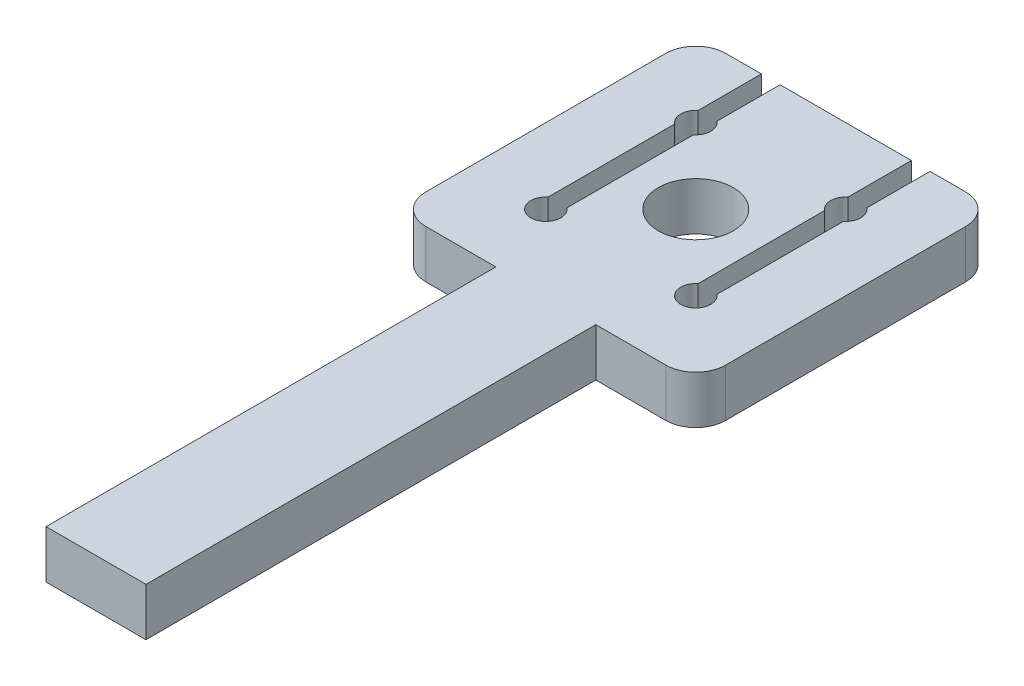
ISO-10303-21;
HEADER;
FILE_DESCRIPTION(('STEP AP214'),'2;1');
FILE_NAME('part.step','',(''),(''),'','','');
FILE_SCHEMA(('AUTOMOTIVE_DESIGN { 1 0 10303 214 1 1 1 1 }'));
ENDSEC;
DATA;
#1=APPLICATION_CONTEXT('core data for automotive mechanical design processes');
#2=APPLICATION_PROTOCOL_DEFINITION('international standard','automotive_design',2000,#1);
#3=PRODUCT_CONTEXT('',#1,'mechanical');
#4=PRODUCT('Part','Part','',(#3));
#5=PRODUCT_RELATED_PRODUCT_CATEGORY('part','',(#4));
#6=PRODUCT_DEFINITION_FORMATION('','',#4);
#7=PRODUCT_DEFINITION_CONTEXT('part definition',#1,'design');
#8=PRODUCT_DEFINITION('design','',#6,#7);
#9=PRODUCT_DEFINITION_SHAPE('','',#8);
#10=(LENGTH_UNIT() NAMED_UNIT(*) SI_UNIT(.MILLI.,.METRE.));
#11=(NAMED_UNIT(*) PLANE_ANGLE_UNIT() SI_UNIT($,.RADIAN.));
#12=(NAMED_UNIT(*) SI_UNIT($,.STERADIAN.) SOLID_ANGLE_UNIT());
#13=UNCERTAINTY_MEASURE_WITH_UNIT(LENGTH_MEASURE(1.E-05),#10,'distance_accuracy_value','');
#14=(GEOMETRIC_REPRESENTATION_CONTEXT(3) GLOBAL_UNCERTAINTY_ASSIGNED_CONTEXT((#13)) GLOBAL_UNIT_ASSIGNED_CONTEXT((#10,
#11,#12)) REPRESENTATION_CONTEXT('',''));
#15=CARTESIAN_POINT('',(0.,0.,0.));
#16=DIRECTION('',(0.,0.,1.));
#17=DIRECTION('',(1.,0.,0.));
#18=AXIS2_PLACEMENT_3D('',#15,#16,#17);
#19=CARTESIAN_POINT('',(-5.,3.2,5.));
#20=DIRECTION('',(0.,-1.,0.));
#21=DIRECTION('',(0.,0.,-1.));
#22=AXIS2_PLACEMENT_3D('',#19,#20,#21);
#23=CYLINDRICAL_SURFACE('',#22,0.999999999999925);
#24=CARTESIAN_POINT('',(-5.,0.,5.));
#25=DIRECTION('',(0.,1.,0.));
#26=DIRECTION('',(0.,0.,1.));
#27=AXIS2_PLACEMENT_3D('',#24,#25,#26);
#28=CIRCLE('',#27,0.999999999999925);
#29=CARTESIAN_POINT('',(-5.625,0.,4.21937525020019));
#30=VERTEX_POINT('',#29);
#31=CARTESIAN_POINT('',(-4.375,0.,4.21937525020019));
#32=VERTEX_POINT('',#31);
#33=EDGE_CURVE('E230',#30,#32,#28,.T.);
#34=ORIENTED_EDGE('',*,*,#33,.F.);
#35=DIRECTION('',(0.,-1.,0.));
#36=VECTOR('',#35,1.);
#37=CARTESIAN_POINT('',(-5.625,3.2,4.21937525020019));
#38=LINE('',#37,#36);
#39=CARTESIAN_POINT('',(-5.625,3.2,4.21937525020019));
#40=VERTEX_POINT('',#39);
#41=EDGE_CURVE('E224',#40,#30,#38,.T.);
#42=ORIENTED_EDGE('',*,*,#41,.F.);
#43=CARTESIAN_POINT('',(-5.,3.2,5.));
#44=DIRECTION('',(0.,1.,0.));
#45=DIRECTION('',(0.,0.,1.));
#46=AXIS2_PLACEMENT_3D('',#43,#44,#45);
#47=CIRCLE('',#46,0.999999999999925);
#48=CARTESIAN_POINT('',(-4.375,3.2,4.21937525020019));
#49=VERTEX_POINT('',#48);
#50=EDGE_CURVE('E227',#40,#49,#47,.T.);
#51=ORIENTED_EDGE('',*,*,#50,.T.);
#52=DIRECTION('',(0.,-1.,0.));
#53=VECTOR('',#52,1.);
#54=CARTESIAN_POINT('',(-4.375,3.2,4.21937525020019));
#55=LINE('',#54,#53);
#56=EDGE_CURVE('E290',#49,#32,#55,.T.);
#57=ORIENTED_EDGE('',*,*,#56,.T.);
#58=EDGE_LOOP('',(#34,#42,#51,#57));
#59=FACE_BOUND('',#58,.T.);
#60=ADVANCED_FACE('F37',(#59),#23,.F.);
#61=CARTESIAN_POINT('',(-5.625,3.2,0.));
#62=DIRECTION('',(-1.,0.,0.));
#63=DIRECTION('',(0.,0.,1.));
#64=AXIS2_PLACEMENT_3D('',#61,#62,#63);
#65=PLANE('',#64);
#66=DIRECTION('',(0.,0.,-1.));
#67=VECTOR('',#66,1.);
#68=CARTESIAN_POINT('',(-5.625,0.,0.));
#69=LINE('',#68,#67);
#70=CARTESIAN_POINT('',(-5.625,0.,-4.21937525020019));
#71=VERTEX_POINT('',#70);
#72=EDGE_CURVE('E292',#30,#71,#69,.T.);
#73=ORIENTED_EDGE('',*,*,#72,.T.);
#74=DIRECTION('',(0.,-1.,0.));
#75=VECTOR('',#74,1.);
#76=CARTESIAN_POINT('',(-5.625,3.2,-4.21937525020019));
#77=LINE('',#76,#75);
#78=CARTESIAN_POINT('',(-5.625,3.2,-4.21937525020019));
#79=VERTEX_POINT('',#78);
#80=EDGE_CURVE('E235',#79,#71,#77,.T.);
#81=ORIENTED_EDGE('',*,*,#80,.F.);
#82=DIRECTION('',(0.,0.,-1.));
#83=VECTOR('',#82,1.);
#84=CARTESIAN_POINT('',(-5.625,3.2,0.));
#85=LINE('',#84,#83);
#86=EDGE_CURVE('E238',#40,#79,#85,.T.);
#87=ORIENTED_EDGE('',*,*,#86,.F.);
#88=ORIENTED_EDGE('',*,*,#41,.T.);
#89=EDGE_LOOP('',(#73,#81,#87,#88));
#90=FACE_BOUND('',#89,.T.);
#91=ADVANCED_FACE('F239',(#90),#65,.F.);
#92=CARTESIAN_POINT('',(-5.,3.2,-5.));
#93=DIRECTION('',(0.,-1.,0.));
#94=DIRECTION('',(0.,0.,-1.));
#95=AXIS2_PLACEMENT_3D('',#92,#93,#94);
#96=CYLINDRICAL_SURFACE('',#95,0.999999999999972);
#97=CARTESIAN_POINT('',(-5.,0.,-5.));
#98=DIRECTION('',(0.,1.,0.));
#99=DIRECTION('',(0.,0.,1.));
#100=AXIS2_PLACEMENT_3D('',#97,#98,#99);
#101=CIRCLE('',#100,0.999999999999972);
#102=CARTESIAN_POINT('',(-5.625,0.,-5.7806247497998));
#103=VERTEX_POINT('',#102);
#104=EDGE_CURVE('E294',#103,#71,#101,.T.);
#105=ORIENTED_EDGE('',*,*,#104,.F.);
#106=DIRECTION('',(0.,-1.,0.));
#107=VECTOR('',#106,1.);
#108=CARTESIAN_POINT('',(-5.625,3.2,-5.7806247497998));
#109=LINE('',#108,#107);
#110=CARTESIAN_POINT('',(-5.625,3.2,-5.7806247497998));
#111=VERTEX_POINT('',#110);
#112=EDGE_CURVE('E384',#111,#103,#109,.T.);
#113=ORIENTED_EDGE('',*,*,#112,.F.);
#114=CARTESIAN_POINT('',(-5.,3.2,-5.));
#115=DIRECTION('',(0.,1.,0.));
#116=DIRECTION('',(0.,0.,1.));
#117=AXIS2_PLACEMENT_3D('',#114,#115,#116);
#118=CIRCLE('',#117,0.999999999999972);
#119=EDGE_CURVE('E242',#111,#79,#118,.T.);
#120=ORIENTED_EDGE('',*,*,#119,.T.);
#121=ORIENTED_EDGE('',*,*,#80,.T.);
#122=EDGE_LOOP('',(#105,#113,#120,#121));
#123=FACE_BOUND('',#122,.T.);
#124=ADVANCED_FACE('F584',(#123),#96,.F.);
#125=CARTESIAN_POINT('',(-5.625,3.2,0.));
#126=DIRECTION('',(-1.,0.,0.));
#127=DIRECTION('',(0.,0.,1.));
#128=AXIS2_PLACEMENT_3D('',#125,#126,#127);
#129=PLANE('',#128);
#130=DIRECTION('',(0.,0.,-1.));
#131=VECTOR('',#130,1.);
#132=CARTESIAN_POINT('',(-5.625,0.,0.));
#133=LINE('',#132,#131);
#134=CARTESIAN_POINT('',(-5.625,0.,-10.));
#135=VERTEX_POINT('',#134);
#136=EDGE_CURVE('E297',#103,#135,#133,.T.);
#137=ORIENTED_EDGE('',*,*,#136,.T.);
#138=DIRECTION('',(0.,-1.,0.));
#139=VECTOR('',#138,1.);
#140=CARTESIAN_POINT('',(-5.625,3.2,-10.));
#141=LINE('',#140,#139);
#142=CARTESIAN_POINT('',(-5.625,3.2,-10.));
#143=VERTEX_POINT('',#142);
#144=EDGE_CURVE('E381',#143,#135,#141,.T.);
#145=ORIENTED_EDGE('',*,*,#144,.F.);
#146=DIRECTION('',(0.,0.,-1.));
#147=VECTOR('',#146,1.);
#148=CARTESIAN_POINT('',(-5.625,3.2,0.));
#149=LINE('',#148,#147);
#150=EDGE_CURVE('E268',#111,#143,#149,.T.);
#151=ORIENTED_EDGE('',*,*,#150,.F.);
#152=ORIENTED_EDGE('',*,*,#112,.T.);
#153=EDGE_LOOP('',(#137,#145,#151,#152));
#154=FACE_BOUND('',#153,.T.);
#155=ADVANCED_FACE('F686',(#154),#129,.F.);
#156=CARTESIAN_POINT('',(0.,3.2,-10.));
#157=DIRECTION('',(0.,0.,-1.));
#158=DIRECTION('',(-1.,0.,0.));
#159=AXIS2_PLACEMENT_3D('',#156,#157,#158);
#160=PLANE('',#159);
#161=DIRECTION('',(1.,0.,0.));
#162=VECTOR('',#161,1.);
#163=CARTESIAN_POINT('',(0.,0.,-10.));
#164=LINE('',#163,#162);
#165=CARTESIAN_POINT('',(-8.,0.,-10.));
#166=VERTEX_POINT('',#165);
#167=EDGE_CURVE('E301',#166,#135,#164,.T.);
#168=ORIENTED_EDGE('',*,*,#167,.F.);
#169=DIRECTION('',(0.,-1.,0.));
#170=VECTOR('',#169,1.);
#171=CARTESIAN_POINT('',(-8.,3.2,-10.));
#172=LINE('',#171,#170);
#173=CARTESIAN_POINT('',(-8.,3.2,-10.));
#174=VERTEX_POINT('',#173);
#175=EDGE_CURVE('E45',#166,#174,#172,.F.);
#176=ORIENTED_EDGE('',*,*,#175,.T.);
#177=DIRECTION('',(1.,0.,0.));
#178=VECTOR('',#177,1.);
#179=CARTESIAN_POINT('',(0.,3.2,-10.));
#180=LINE('',#179,#178);
#181=EDGE_CURVE('E415',#174,#143,#180,.T.);
#182=ORIENTED_EDGE('',*,*,#181,.T.);
#183=ORIENTED_EDGE('',*,*,#144,.T.);
#184=EDGE_LOOP('',(#168,#176,#182,#183));
#185=FACE_BOUND('',#184,.T.);
#186=ADVANCED_FACE('F446',(#185),#160,.T.);
#187=CARTESIAN_POINT('',(-10.,3.2,0.));
#188=DIRECTION('',(1.,0.,0.));
#189=DIRECTION('',(0.,0.,-1.));
#190=AXIS2_PLACEMENT_3D('',#187,#188,#189);
#191=PLANE('',#190);
#192=DIRECTION('',(0.,0.,1.));
#193=VECTOR('',#192,1.);
#194=CARTESIAN_POINT('',(-10.,0.,0.));
#195=LINE('',#194,#193);
#196=CARTESIAN_POINT('',(-10.,0.,-8.));
#197=VERTEX_POINT('',#196);
#198=CARTESIAN_POINT('',(-10.,0.,8.));
#199=VERTEX_POINT('',#198);
#200=EDGE_CURVE('E303',#197,#199,#195,.T.);
#201=ORIENTED_EDGE('',*,*,#200,.T.);
#202=DIRECTION('',(0.,-1.,0.));
#203=VECTOR('',#202,1.);
#204=CARTESIAN_POINT('',(-10.,3.2,8.));
#205=LINE('',#204,#203);
#206=CARTESIAN_POINT('',(-10.,3.2,8.));
#207=VERTEX_POINT('',#206);
#208=EDGE_CURVE('E400',#199,#207,#205,.F.);
#209=ORIENTED_EDGE('',*,*,#208,.T.);
#210=DIRECTION('',(0.,0.,1.));
#211=VECTOR('',#210,1.);
#212=CARTESIAN_POINT('',(-10.,3.2,0.));
#213=LINE('',#212,#211);
#214=CARTESIAN_POINT('',(-10.,3.2,-8.));
#215=VERTEX_POINT('',#214);
#216=EDGE_CURVE('E418',#215,#207,#213,.T.);
#217=ORIENTED_EDGE('',*,*,#216,.F.);
#218=DIRECTION('',(0.,-1.,0.));
#219=VECTOR('',#218,1.);
#220=CARTESIAN_POINT('',(-10.,0.,-8.));
#221=LINE('',#220,#219);
#222=EDGE_CURVE('E397',#215,#197,#221,.T.);
#223=ORIENTED_EDGE('',*,*,#222,.T.);
#224=EDGE_LOOP('',(#201,#209,#217,#223));
#225=FACE_BOUND('',#224,.T.);
#226=ADVANCED_FACE('F457',(#225),#191,.F.);
#227=CARTESIAN_POINT('',(0.,3.2,10.));
#228=DIRECTION('',(0.,0.,-1.));
#229=DIRECTION('',(-1.,0.,0.));
#230=AXIS2_PLACEMENT_3D('',#227,#228,#229);
#231=PLANE('',#230);
#232=DIRECTION('',(1.,0.,0.));
#233=VECTOR('',#232,1.);
#234=CARTESIAN_POINT('',(0.,3.2,10.));
#235=LINE('',#234,#233);
#236=CARTESIAN_POINT('',(-8.,3.2,10.));
#237=VERTEX_POINT('',#236);
#238=CARTESIAN_POINT('',(-3.33333333333334,3.2,10.));
#239=VERTEX_POINT('',#238);
#240=EDGE_CURVE('E424',#237,#239,#235,.T.);
#241=ORIENTED_EDGE('',*,*,#240,.F.);
#242=DIRECTION('',(0.,-1.,0.));
#243=VECTOR('',#242,1.);
#244=CARTESIAN_POINT('',(-8.,3.2,10.));
#245=LINE('',#244,#243);
#246=CARTESIAN_POINT('',(-8.,0.,10.));
#247=VERTEX_POINT('',#246);
#248=EDGE_CURVE('E234',#237,#247,#245,.T.);
#249=ORIENTED_EDGE('',*,*,#248,.T.);
#250=DIRECTION('',(1.,0.,0.));
#251=VECTOR('',#250,1.);
#252=CARTESIAN_POINT('',(0.,0.,10.));
#253=LINE('',#252,#251);
#254=CARTESIAN_POINT('',(-3.33333333333334,0.,10.));
#255=VERTEX_POINT('',#254);
#256=EDGE_CURVE('E308',#247,#255,#253,.T.);
#257=ORIENTED_EDGE('',*,*,#256,.T.);
#258=DIRECTION('',(0.,-1.,0.));
#259=VECTOR('',#258,1.);
#260=CARTESIAN_POINT('',(-3.33333333333334,3.2,10.));
#261=LINE('',#260,#259);
#262=EDGE_CURVE('E378',#239,#255,#261,.T.);
#263=ORIENTED_EDGE('',*,*,#262,.F.);
#264=EDGE_LOOP('',(#241,#249,#257,#263));
#265=FACE_BOUND('',#264,.T.);
#266=ADVANCED_FACE('F470',(#265),#231,.F.);
#267=CARTESIAN_POINT('',(-3.33333333333334,3.2,0.));
#268=DIRECTION('',(1.,0.,0.));
#269=DIRECTION('',(0.,0.,-1.));
#270=AXIS2_PLACEMENT_3D('',#267,#268,#269);
#271=PLANE('',#270);
#272=DIRECTION('',(0.,0.,1.));
#273=VECTOR('',#272,1.);
#274=CARTESIAN_POINT('',(-3.33333333333334,0.,0.));
#275=LINE('',#274,#273);
#276=CARTESIAN_POINT('',(-3.33333333333333,0.,40.));
#277=VERTEX_POINT('',#276);
#278=EDGE_CURVE('E310',#255,#277,#275,.T.);
#279=ORIENTED_EDGE('',*,*,#278,.T.);
#280=DIRECTION('',(0.,-1.,0.));
#281=VECTOR('',#280,1.);
#282=CARTESIAN_POINT('',(-3.33333333333333,3.2,40.));
#283=LINE('',#282,#281);
#284=CARTESIAN_POINT('',(-3.33333333333333,3.2,40.));
#285=VERTEX_POINT('',#284);
#286=EDGE_CURVE('E375',#285,#277,#283,.T.);
#287=ORIENTED_EDGE('',*,*,#286,.F.);
#288=DIRECTION('',(0.,0.,1.));
#289=VECTOR('',#288,1.);
#290=CARTESIAN_POINT('',(-3.33333333333334,3.2,0.));
#291=LINE('',#290,#289);
#292=EDGE_CURVE('E473',#239,#285,#291,.T.);
#293=ORIENTED_EDGE('',*,*,#292,.F.);
#294=ORIENTED_EDGE('',*,*,#262,.T.);
#295=EDGE_LOOP('',(#279,#287,#293,#294));
#296=FACE_BOUND('',#295,.T.);
#297=ADVANCED_FACE('F570',(#296),#271,.F.);
#298=CARTESIAN_POINT('',(0.,3.2,40.));
#299=DIRECTION('',(0.,0.,-1.));
#300=DIRECTION('',(-1.,0.,0.));
#301=AXIS2_PLACEMENT_3D('',#298,#299,#300);
#302=PLANE('',#301);
#303=DIRECTION('',(1.,0.,0.));
#304=VECTOR('',#303,1.);
#305=CARTESIAN_POINT('',(0.,0.,40.));
#306=LINE('',#305,#304);
#307=CARTESIAN_POINT('',(3.33333333333333,0.,40.));
#308=VERTEX_POINT('',#307);
#309=EDGE_CURVE('E312',#277,#308,#306,.T.);
#310=ORIENTED_EDGE('',*,*,#309,.T.);
#311=DIRECTION('',(0.,-1.,0.));
#312=VECTOR('',#311,1.);
#313=CARTESIAN_POINT('',(3.33333333333333,3.2,40.));
#314=LINE('',#313,#312);
#315=CARTESIAN_POINT('',(3.33333333333333,3.2,40.));
#316=VERTEX_POINT('',#315);
#317=EDGE_CURVE('E372',#316,#308,#314,.T.);
#318=ORIENTED_EDGE('',*,*,#317,.F.);
#319=DIRECTION('',(1.,0.,0.));
#320=VECTOR('',#319,1.);
#321=CARTESIAN_POINT('',(0.,3.2,40.));
#322=LINE('',#321,#320);
#323=EDGE_CURVE('E474',#285,#316,#322,.T.);
#324=ORIENTED_EDGE('',*,*,#323,.F.);
#325=ORIENTED_EDGE('',*,*,#286,.T.);
#326=EDGE_LOOP('',(#310,#318,#324,#325));
#327=FACE_BOUND('',#326,.T.);
#328=ADVANCED_FACE('F567',(#327),#302,.F.);
#329=CARTESIAN_POINT('',(3.33333333333333,3.2,0.));
#330=DIRECTION('',(-1.,0.,0.));
#331=DIRECTION('',(0.,0.,1.));
#332=AXIS2_PLACEMENT_3D('',#329,#330,#331);
#333=PLANE('',#332);
#334=DIRECTION('',(0.,0.,-1.));
#335=VECTOR('',#334,1.);
#336=CARTESIAN_POINT('',(3.33333333333333,0.,0.));
#337=LINE('',#336,#335);
#338=CARTESIAN_POINT('',(3.33333333333333,0.,10.));
#339=VERTEX_POINT('',#338);
#340=EDGE_CURVE('E314',#308,#339,#337,.T.);
#341=ORIENTED_EDGE('',*,*,#340,.T.);
#342=DIRECTION('',(0.,-1.,0.));
#343=VECTOR('',#342,1.);
#344=CARTESIAN_POINT('',(3.33333333333333,3.2,10.));
#345=LINE('',#344,#343);
#346=CARTESIAN_POINT('',(3.33333333333333,3.2,10.));
#347=VERTEX_POINT('',#346);
#348=EDGE_CURVE('E369',#347,#339,#345,.T.);
#349=ORIENTED_EDGE('',*,*,#348,.F.);
#350=DIRECTION('',(0.,0.,-1.));
#351=VECTOR('',#350,1.);
#352=CARTESIAN_POINT('',(3.33333333333333,3.2,0.));
#353=LINE('',#352,#351);
#354=EDGE_CURVE('E476',#316,#347,#353,.T.);
#355=ORIENTED_EDGE('',*,*,#354,.F.);
#356=ORIENTED_EDGE('',*,*,#317,.T.);
#357=EDGE_LOOP('',(#341,#349,#355,#356));
#358=FACE_BOUND('',#357,.T.);
#359=ADVANCED_FACE('F563',(#358),#333,.F.);
#360=CARTESIAN_POINT('',(0.,3.2,10.));
#361=DIRECTION('',(0.,0.,-1.));
#362=DIRECTION('',(-1.,0.,0.));
#363=AXIS2_PLACEMENT_3D('',#360,#361,#362);
#364=PLANE('',#363);
#365=DIRECTION('',(1.,0.,0.));
#366=VECTOR('',#365,1.);
#367=CARTESIAN_POINT('',(0.,0.,10.));
#368=LINE('',#367,#366);
#369=CARTESIAN_POINT('',(8.,0.,10.));
#370=VERTEX_POINT('',#369);
#371=EDGE_CURVE('E316',#339,#370,#368,.T.);
#372=ORIENTED_EDGE('',*,*,#371,.T.);
#373=DIRECTION('',(0.,-1.,0.));
#374=VECTOR('',#373,1.);
#375=CARTESIAN_POINT('',(8.,3.2,10.));
#376=LINE('',#375,#374);
#377=CARTESIAN_POINT('',(8.,3.2,10.));
#378=VERTEX_POINT('',#377);
#379=EDGE_CURVE('E441',#370,#378,#376,.F.);
#380=ORIENTED_EDGE('',*,*,#379,.T.);
#381=DIRECTION('',(1.,0.,0.));
#382=VECTOR('',#381,1.);
#383=CARTESIAN_POINT('',(0.,3.2,10.));
#384=LINE('',#383,#382);
#385=EDGE_CURVE('E486',#347,#378,#384,.T.);
#386=ORIENTED_EDGE('',*,*,#385,.F.);
#387=ORIENTED_EDGE('',*,*,#348,.T.);
#388=EDGE_LOOP('',(#372,#380,#386,#387));
#389=FACE_BOUND('',#388,.T.);
#390=ADVANCED_FACE('F558',(#389),#364,.F.);
#391=CARTESIAN_POINT('',(10.,3.2,0.));
#392=DIRECTION('',(1.,0.,0.));
#393=DIRECTION('',(0.,0.,-1.));
#394=AXIS2_PLACEMENT_3D('',#391,#392,#393);
#395=PLANE('',#394);
#396=DIRECTION('',(0.,0.,1.));
#397=VECTOR('',#396,1.);
#398=CARTESIAN_POINT('',(10.,3.2,0.));
#399=LINE('',#398,#397);
#400=CARTESIAN_POINT('',(10.,3.2,-8.));
#401=VERTEX_POINT('',#400);
#402=CARTESIAN_POINT('',(10.,3.2,8.00000000000001));
#403=VERTEX_POINT('',#402);
#404=EDGE_CURVE('E488',#401,#403,#399,.T.);
#405=ORIENTED_EDGE('',*,*,#404,.T.);
#406=DIRECTION('',(0.,-1.,0.));
#407=VECTOR('',#406,1.);
#408=CARTESIAN_POINT('',(10.,0.,8.00000000000001));
#409=LINE('',#408,#407);
#410=CARTESIAN_POINT('',(10.,0.,8.00000000000001));
#411=VERTEX_POINT('',#410);
#412=EDGE_CURVE('E438',#403,#411,#409,.T.);
#413=ORIENTED_EDGE('',*,*,#412,.T.);
#414=DIRECTION('',(0.,0.,1.));
#415=VECTOR('',#414,1.);
#416=CARTESIAN_POINT('',(10.,0.,0.));
#417=LINE('',#416,#415);
#418=CARTESIAN_POINT('',(10.,0.,-8.));
#419=VERTEX_POINT('',#418);
#420=EDGE_CURVE('E319',#419,#411,#417,.T.);
#421=ORIENTED_EDGE('',*,*,#420,.F.);
#422=DIRECTION('',(0.,-1.,0.));
#423=VECTOR('',#422,1.);
#424=CARTESIAN_POINT('',(10.,3.2,-8.));
#425=LINE('',#424,#423);
#426=EDGE_CURVE('E435',#419,#401,#425,.F.);
#427=ORIENTED_EDGE('',*,*,#426,.T.);
#428=EDGE_LOOP('',(#405,#413,#421,#427));
#429=FACE_BOUND('',#428,.T.);
#430=ADVANCED_FACE('F550',(#429),#395,.T.);
#431=CARTESIAN_POINT('',(5.625,3.2,-10.));
#432=VERTEX_POINT('',#431);
#433=CARTESIAN_POINT('',(8.,3.2,-10.));
#434=VERTEX_POINT('',#433);
#435=EDGE_CURVE('E419',#432,#434,#180,.T.);
#436=ORIENTED_EDGE('',*,*,#435,.T.);
#437=DIRECTION('',(0.,-1.,0.));
#438=VECTOR('',#437,1.);
#439=CARTESIAN_POINT('',(8.,3.2,-10.));
#440=LINE('',#439,#438);
#441=CARTESIAN_POINT('',(8.,0.,-10.));
#442=VERTEX_POINT('',#441);
#443=EDGE_CURVE('E12',#434,#442,#440,.T.);
#444=ORIENTED_EDGE('',*,*,#443,.T.);
#445=CARTESIAN_POINT('',(5.625,0.,-10.));
#446=VERTEX_POINT('',#445);
#447=EDGE_CURVE('E305',#446,#442,#164,.T.);
#448=ORIENTED_EDGE('',*,*,#447,.F.);
#449=DIRECTION('',(0.,-1.,0.));
#450=VECTOR('',#449,1.);
#451=CARTESIAN_POINT('',(5.625,3.2,-10.));
#452=LINE('',#451,#450);
#453=EDGE_CURVE('E367',#432,#446,#452,.T.);
#454=ORIENTED_EDGE('',*,*,#453,.F.);
#455=EDGE_LOOP('',(#436,#444,#448,#454));
#456=FACE_BOUND('',#455,.T.);
#457=ADVANCED_FACE('F543',(#456),#160,.T.);
#458=CARTESIAN_POINT('',(5.625,3.2,0.));
#459=DIRECTION('',(-1.,0.,0.));
#460=DIRECTION('',(0.,0.,1.));
#461=AXIS2_PLACEMENT_3D('',#458,#459,#460);
#462=PLANE('',#461);
#463=DIRECTION('',(0.,0.,-1.));
#464=VECTOR('',#463,1.);
#465=CARTESIAN_POINT('',(5.625,0.,0.));
#466=LINE('',#465,#464);
#467=CARTESIAN_POINT('',(5.625,0.,-5.78062474979979));
#468=VERTEX_POINT('',#467);
#469=EDGE_CURVE('E322',#468,#446,#466,.T.);
#470=ORIENTED_EDGE('',*,*,#469,.F.);
#471=DIRECTION('',(0.,-1.,0.));
#472=VECTOR('',#471,1.);
#473=CARTESIAN_POINT('',(5.625,3.2,-5.78062474979979));
#474=LINE('',#473,#472);
#475=CARTESIAN_POINT('',(5.625,3.2,-5.78062474979979));
#476=VERTEX_POINT('',#475);
#477=EDGE_CURVE('E365',#476,#468,#474,.T.);
#478=ORIENTED_EDGE('',*,*,#477,.F.);
#479=DIRECTION('',(0.,0.,-1.));
#480=VECTOR('',#479,1.);
#481=CARTESIAN_POINT('',(5.625,3.2,0.));
#482=LINE('',#481,#480);
#483=EDGE_CURVE('E490',#476,#432,#482,.T.);
#484=ORIENTED_EDGE('',*,*,#483,.T.);
#485=ORIENTED_EDGE('',*,*,#453,.T.);
#486=EDGE_LOOP('',(#470,#478,#484,#485));
#487=FACE_BOUND('',#486,.T.);
#488=ADVANCED_FACE('F641',(#487),#462,.T.);
#489=CARTESIAN_POINT('',(5.,3.2,-5.));
#490=DIRECTION('',(0.,-1.,0.));
#491=DIRECTION('',(0.,0.,-1.));
#492=AXIS2_PLACEMENT_3D('',#489,#490,#491);
#493=CYLINDRICAL_SURFACE('',#492,1.00000000000005);
#494=CARTESIAN_POINT('',(5.,0.,-5.));
#495=DIRECTION('',(0.,1.,0.));
#496=DIRECTION('',(0.,0.,1.));
#497=AXIS2_PLACEMENT_3D('',#494,#495,#496);
#498=CIRCLE('',#497,1.00000000000005);
#499=CARTESIAN_POINT('',(5.625,0.,-4.21937525020018));
#500=VERTEX_POINT('',#499);
#501=EDGE_CURVE('E325',#500,#468,#498,.T.);
#502=ORIENTED_EDGE('',*,*,#501,.F.);
#503=DIRECTION('',(0.,-1.,0.));
#504=VECTOR('',#503,1.);
#505=CARTESIAN_POINT('',(5.625,3.2,-4.21937525020018));
#506=LINE('',#505,#504);
#507=CARTESIAN_POINT('',(5.625,3.2,-4.21937525020018));
#508=VERTEX_POINT('',#507);
#509=EDGE_CURVE('E363',#508,#500,#506,.T.);
#510=ORIENTED_EDGE('',*,*,#509,.F.);
#511=CARTESIAN_POINT('',(5.,3.2,-5.));
#512=DIRECTION('',(0.,1.,0.));
#513=DIRECTION('',(0.,0.,1.));
#514=AXIS2_PLACEMENT_3D('',#511,#512,#513);
#515=CIRCLE('',#514,1.00000000000005);
#516=EDGE_CURVE('E494',#508,#476,#515,.T.);
#517=ORIENTED_EDGE('',*,*,#516,.T.);
#518=ORIENTED_EDGE('',*,*,#477,.T.);
#519=EDGE_LOOP('',(#502,#510,#517,#518));
#520=FACE_BOUND('',#519,.T.);
#521=ADVANCED_FACE('F523',(#520),#493,.F.);
#522=CARTESIAN_POINT('',(5.625,3.2,0.));
#523=DIRECTION('',(-1.,0.,0.));
#524=DIRECTION('',(0.,0.,1.));
#525=AXIS2_PLACEMENT_3D('',#522,#523,#524);
#526=PLANE('',#525);
#527=DIRECTION('',(0.,0.,-1.));
#528=VECTOR('',#527,1.);
#529=CARTESIAN_POINT('',(5.625,0.,0.));
#530=LINE('',#529,#528);
#531=CARTESIAN_POINT('',(5.625,0.,4.2193752502002));
#532=VERTEX_POINT('',#531);
#533=EDGE_CURVE('E328',#532,#500,#530,.T.);
#534=ORIENTED_EDGE('',*,*,#533,.F.);
#535=DIRECTION('',(0.,-1.,0.));
#536=VECTOR('',#535,1.);
#537=CARTESIAN_POINT('',(5.625,3.2,4.2193752502002));
#538=LINE('',#537,#536);
#539=CARTESIAN_POINT('',(5.625,3.2,4.2193752502002));
#540=VERTEX_POINT('',#539);
#541=EDGE_CURVE('E361',#540,#532,#538,.T.);
#542=ORIENTED_EDGE('',*,*,#541,.F.);
#543=DIRECTION('',(0.,0.,-1.));
#544=VECTOR('',#543,1.);
#545=CARTESIAN_POINT('',(5.625,3.2,0.));
#546=LINE('',#545,#544);
#547=EDGE_CURVE('E498',#540,#508,#546,.T.);
#548=ORIENTED_EDGE('',*,*,#547,.T.);
#549=ORIENTED_EDGE('',*,*,#509,.T.);
#550=EDGE_LOOP('',(#534,#542,#548,#549));
#551=FACE_BOUND('',#550,.T.);
#552=ADVANCED_FACE('F518',(#551),#526,.T.);
#553=CARTESIAN_POINT('',(5.00000000000003,3.2,5.00000000000004));
#554=DIRECTION('',(0.,-1.,0.));
#555=DIRECTION('',(0.,0.,-1.));
#556=AXIS2_PLACEMENT_3D('',#553,#554,#555);
#557=CYLINDRICAL_SURFACE('',#556,0.999999999999999);
#558=CARTESIAN_POINT('',(5.00000000000003,0.,5.00000000000004));
#559=DIRECTION('',(0.,1.,0.));
#560=DIRECTION('',(0.,0.,1.));
#561=AXIS2_PLACEMENT_3D('',#558,#559,#560);
#562=CIRCLE('',#561,0.999999999999999);
#563=CARTESIAN_POINT('',(4.375,0.,4.2193752502002));
#564=VERTEX_POINT('',#563);
#565=EDGE_CURVE('E332',#564,#532,#562,.T.);
#566=ORIENTED_EDGE('',*,*,#565,.F.);
#567=DIRECTION('',(0.,-1.,0.));
#568=VECTOR('',#567,1.);
#569=CARTESIAN_POINT('',(4.375,3.2,4.2193752502002));
#570=LINE('',#569,#568);
#571=CARTESIAN_POINT('',(4.375,3.2,4.2193752502002));
#572=VERTEX_POINT('',#571);
#573=EDGE_CURVE('E359',#572,#564,#570,.T.);
#574=ORIENTED_EDGE('',*,*,#573,.F.);
#575=CARTESIAN_POINT('',(5.00000000000003,3.2,5.00000000000004));
#576=DIRECTION('',(0.,1.,0.));
#577=DIRECTION('',(0.,0.,1.));
#578=AXIS2_PLACEMENT_3D('',#575,#576,#577);
#579=CIRCLE('',#578,0.999999999999999);
#580=EDGE_CURVE('E509',#572,#540,#579,.T.);
#581=ORIENTED_EDGE('',*,*,#580,.T.);
#582=ORIENTED_EDGE('',*,*,#541,.T.);
#583=EDGE_LOOP('',(#566,#574,#581,#582));
#584=FACE_BOUND('',#583,.T.);
#585=ADVANCED_FACE('F528',(#584),#557,.F.);
#586=CARTESIAN_POINT('',(4.375,3.2,0.));
#587=DIRECTION('',(-1.,0.,0.));
#588=DIRECTION('',(0.,0.,1.));
#589=AXIS2_PLACEMENT_3D('',#586,#587,#588);
#590=PLANE('',#589);
#591=DIRECTION('',(0.,0.,-1.));
#592=VECTOR('',#591,1.);
#593=CARTESIAN_POINT('',(4.375,0.,0.));
#594=LINE('',#593,#592);
#595=CARTESIAN_POINT('',(4.375,0.,-4.21937525020018));
#596=VERTEX_POINT('',#595);
#597=EDGE_CURVE('E335',#564,#596,#594,.T.);
#598=ORIENTED_EDGE('',*,*,#597,.T.);
#599=DIRECTION('',(0.,-1.,0.));
#600=VECTOR('',#599,1.);
#601=CARTESIAN_POINT('',(4.375,3.2,-4.21937525020018));
#602=LINE('',#601,#600);
#603=CARTESIAN_POINT('',(4.375,3.2,-4.21937525020018));
#604=VERTEX_POINT('',#603);
#605=EDGE_CURVE('E357',#604,#596,#602,.T.);
#606=ORIENTED_EDGE('',*,*,#605,.F.);
#607=DIRECTION('',(0.,0.,-1.));
#608=VECTOR('',#607,1.);
#609=CARTESIAN_POINT('',(4.375,3.2,0.));
#610=LINE('',#609,#608);
#611=EDGE_CURVE('E507',#572,#604,#610,.T.);
#612=ORIENTED_EDGE('',*,*,#611,.F.);
#613=ORIENTED_EDGE('',*,*,#573,.T.);
#614=EDGE_LOOP('',(#598,#606,#612,#613));
#615=FACE_BOUND('',#614,.T.);
#616=ADVANCED_FACE('F532',(#615),#590,.F.);
#617=CARTESIAN_POINT('',(4.375,0.,-5.78062474979979));
#618=VERTEX_POINT('',#617);
#619=EDGE_CURVE('E329',#618,#596,#498,.T.);
#620=ORIENTED_EDGE('',*,*,#619,.F.);
#621=DIRECTION('',(0.,-1.,0.));
#622=VECTOR('',#621,1.);
#623=CARTESIAN_POINT('',(4.375,3.2,-5.78062474979979));
#624=LINE('',#623,#622);
#625=CARTESIAN_POINT('',(4.375,3.2,-5.78062474979979));
#626=VERTEX_POINT('',#625);
#627=EDGE_CURVE('E355',#626,#618,#624,.T.);
#628=ORIENTED_EDGE('',*,*,#627,.F.);
#629=EDGE_CURVE('E499',#626,#604,#515,.T.);
#630=ORIENTED_EDGE('',*,*,#629,.T.);
#631=ORIENTED_EDGE('',*,*,#605,.T.);
#632=EDGE_LOOP('',(#620,#628,#630,#631));
#633=FACE_BOUND('',#632,.T.);
#634=ADVANCED_FACE('F741',(#633),#493,.F.);
#635=CARTESIAN_POINT('',(4.375,3.2,0.));
#636=DIRECTION('',(-1.,0.,0.));
#637=DIRECTION('',(0.,0.,1.));
#638=AXIS2_PLACEMENT_3D('',#635,#636,#637);
#639=PLANE('',#638);
#640=DIRECTION('',(0.,0.,-1.));
#641=VECTOR('',#640,1.);
#642=CARTESIAN_POINT('',(4.375,0.,0.));
#643=LINE('',#642,#641);
#644=CARTESIAN_POINT('',(4.375,0.,-10.));
#645=VERTEX_POINT('',#644);
#646=EDGE_CURVE('E338',#618,#645,#643,.T.);
#647=ORIENTED_EDGE('',*,*,#646,.T.);
#648=DIRECTION('',(0.,-1.,0.));
#649=VECTOR('',#648,1.);
#650=CARTESIAN_POINT('',(4.375,3.2,-10.));
#651=LINE('',#650,#649);
#652=CARTESIAN_POINT('',(4.375,3.2,-10.));
#653=VERTEX_POINT('',#652);
#654=EDGE_CURVE('E353',#653,#645,#651,.T.);
#655=ORIENTED_EDGE('',*,*,#654,.F.);
#656=DIRECTION('',(0.,0.,-1.));
#657=VECTOR('',#656,1.);
#658=CARTESIAN_POINT('',(4.375,3.2,0.));
#659=LINE('',#658,#657);
#660=EDGE_CURVE('E282',#626,#653,#659,.T.);
#661=ORIENTED_EDGE('',*,*,#660,.F.);
#662=ORIENTED_EDGE('',*,*,#627,.T.);
#663=EDGE_LOOP('',(#647,#655,#661,#662));
#664=FACE_BOUND('',#663,.T.);
#665=ADVANCED_FACE('F733',(#664),#639,.F.);
#666=CARTESIAN_POINT('',(-4.375,0.,-10.));
#667=VERTEX_POINT('',#666);
#668=EDGE_CURVE('E304',#667,#645,#164,.T.);
#669=ORIENTED_EDGE('',*,*,#668,.F.);
#670=DIRECTION('',(0.,-1.,0.));
#671=VECTOR('',#670,1.);
#672=CARTESIAN_POINT('',(-4.375,3.2,-10.));
#673=LINE('',#672,#671);
#674=CARTESIAN_POINT('',(-4.375,3.2,-10.));
#675=VERTEX_POINT('',#674);
#676=EDGE_CURVE('E351',#675,#667,#673,.T.);
#677=ORIENTED_EDGE('',*,*,#676,.F.);
#678=EDGE_CURVE('E281',#675,#653,#180,.T.);
#679=ORIENTED_EDGE('',*,*,#678,.T.);
#680=ORIENTED_EDGE('',*,*,#654,.T.);
#681=EDGE_LOOP('',(#669,#677,#679,#680));
#682=FACE_BOUND('',#681,.T.);
#683=ADVANCED_FACE('F643',(#682),#160,.T.);
#684=CARTESIAN_POINT('',(-4.375,3.2,0.));
#685=DIRECTION('',(-1.,0.,0.));
#686=DIRECTION('',(0.,0.,1.));
#687=AXIS2_PLACEMENT_3D('',#684,#685,#686);
#688=PLANE('',#687);
#689=DIRECTION('',(0.,0.,-1.));
#690=VECTOR('',#689,1.);
#691=CARTESIAN_POINT('',(-4.375,0.,0.));
#692=LINE('',#691,#690);
#693=CARTESIAN_POINT('',(-4.375,0.,-5.78062474979981));
#694=VERTEX_POINT('',#693);
#695=EDGE_CURVE('E341',#694,#667,#692,.T.);
#696=ORIENTED_EDGE('',*,*,#695,.F.);
#697=DIRECTION('',(0.,-1.,0.));
#698=VECTOR('',#697,1.);
#699=CARTESIAN_POINT('',(-4.375,3.2,-5.78062474979981));
#700=LINE('',#699,#698);
#701=CARTESIAN_POINT('',(-4.375,3.2,-5.78062474979981));
#702=VERTEX_POINT('',#701);
#703=EDGE_CURVE('E349',#702,#694,#700,.T.);
#704=ORIENTED_EDGE('',*,*,#703,.F.);
#705=DIRECTION('',(0.,0.,-1.));
#706=VECTOR('',#705,1.);
#707=CARTESIAN_POINT('',(-4.375,3.2,0.));
#708=LINE('',#707,#706);
#709=EDGE_CURVE('E277',#702,#675,#708,.T.);
#710=ORIENTED_EDGE('',*,*,#709,.T.);
#711=ORIENTED_EDGE('',*,*,#676,.T.);
#712=EDGE_LOOP('',(#696,#704,#710,#711));
#713=FACE_BOUND('',#712,.T.);
#714=ADVANCED_FACE('F714',(#713),#688,.T.);
#715=CARTESIAN_POINT('',(-4.375,0.,-4.21937525020019));
#716=VERTEX_POINT('',#715);
#717=EDGE_CURVE('E298',#716,#694,#101,.T.);
#718=ORIENTED_EDGE('',*,*,#717,.F.);
#719=DIRECTION('',(0.,-1.,0.));
#720=VECTOR('',#719,1.);
#721=CARTESIAN_POINT('',(-4.375,3.2,-4.21937525020019));
#722=LINE('',#721,#720);
#723=CARTESIAN_POINT('',(-4.375,3.2,-4.21937525020019));
#724=VERTEX_POINT('',#723);
#725=EDGE_CURVE('E347',#724,#716,#722,.T.);
#726=ORIENTED_EDGE('',*,*,#725,.F.);
#727=EDGE_CURVE('E269',#724,#702,#118,.T.);
#728=ORIENTED_EDGE('',*,*,#727,.T.);
#729=ORIENTED_EDGE('',*,*,#703,.T.);
#730=EDGE_LOOP('',(#718,#726,#728,#729));
#731=FACE_BOUND('',#730,.T.);
#732=ADVANCED_FACE('F704',(#731),#96,.F.);
#733=CARTESIAN_POINT('',(-4.375,3.2,0.));
#734=DIRECTION('',(-1.,0.,0.));
#735=DIRECTION('',(0.,0.,1.));
#736=AXIS2_PLACEMENT_3D('',#733,#734,#735);
#737=PLANE('',#736);
#738=DIRECTION('',(0.,0.,-1.));
#739=VECTOR('',#738,1.);
#740=CARTESIAN_POINT('',(-4.375,0.,0.));
#741=LINE('',#740,#739);
#742=EDGE_CURVE('E253',#32,#716,#741,.T.);
#743=ORIENTED_EDGE('',*,*,#742,.F.);
#744=ORIENTED_EDGE('',*,*,#56,.F.);
#745=DIRECTION('',(0.,0.,-1.));
#746=VECTOR('',#745,1.);
#747=CARTESIAN_POINT('',(-4.375,3.2,0.));
#748=LINE('',#747,#746);
#749=EDGE_CURVE('E249',#49,#724,#748,.T.);
#750=ORIENTED_EDGE('',*,*,#749,.T.);
#751=ORIENTED_EDGE('',*,*,#725,.T.);
#752=EDGE_LOOP('',(#743,#744,#750,#751));
#753=FACE_BOUND('',#752,.T.);
#754=ADVANCED_FACE('F694',(#753),#737,.T.);
#755=CARTESIAN_POINT('',(0.,3.2,0.));
#756=DIRECTION('',(0.,-1.,0.));
#757=DIRECTION('',(0.,0.,-1.));
#758=AXIS2_PLACEMENT_3D('',#755,#756,#757);
#759=CYLINDRICAL_SURFACE('',#758,2.5);
#760=CARTESIAN_POINT('',(0.,3.2,0.));
#761=DIRECTION('',(0.,1.,0.));
#762=DIRECTION('',(0.,0.,1.));
#763=AXIS2_PLACEMENT_3D('',#760,#761,#762);
#764=CIRCLE('',#763,2.5);
#765=CARTESIAN_POINT('',(0.,3.2,2.5));
#766=VERTEX_POINT('',#765);
#767=EDGE_CURVE('E286',#766,#766,#764,.T.);
#768=ORIENTED_EDGE('',*,*,#767,.T.);
#769=EDGE_LOOP('',(#768));
#770=FACE_BOUND('',#769,.T.);
#771=CARTESIAN_POINT('',(0.,0.,0.));
#772=DIRECTION('',(0.,1.,0.));
#773=DIRECTION('',(0.,0.,1.));
#774=AXIS2_PLACEMENT_3D('',#771,#772,#773);
#775=CIRCLE('',#774,2.5);
#776=CARTESIAN_POINT('',(0.,0.,2.5));
#777=VERTEX_POINT('',#776);
#778=EDGE_CURVE('E250',#777,#777,#775,.T.);
#779=ORIENTED_EDGE('',*,*,#778,.F.);
#780=EDGE_LOOP('',(#779));
#781=FACE_BOUND('',#780,.T.);
#782=ADVANCED_FACE('F630',(#770,#781),#759,.F.);
#783=CARTESIAN_POINT('',(0.,3.2,0.));
#784=DIRECTION('',(0.,1.,0.));
#785=DIRECTION('',(0.,0.,1.));
#786=AXIS2_PLACEMENT_3D('',#783,#784,#785);
#787=PLANE('',#786);
#788=ORIENTED_EDGE('',*,*,#216,.T.);
#789=CARTESIAN_POINT('',(-8.,3.2,8.));
#790=DIRECTION('',(0.,1.,0.));
#791=DIRECTION('',(0.,0.,1.));
#792=AXIS2_PLACEMENT_3D('',#789,#790,#791);
#793=CIRCLE('',#792,2.);
#794=EDGE_CURVE('E432',#207,#237,#793,.T.);
#795=ORIENTED_EDGE('',*,*,#794,.T.);
#796=ORIENTED_EDGE('',*,*,#240,.T.);
#797=ORIENTED_EDGE('',*,*,#292,.T.);
#798=ORIENTED_EDGE('',*,*,#323,.T.);
#799=ORIENTED_EDGE('',*,*,#354,.T.);
#800=ORIENTED_EDGE('',*,*,#385,.T.);
#801=CARTESIAN_POINT('',(8.,3.2,8.00000000000001));
#802=DIRECTION('',(0.,1.,0.));
#803=DIRECTION('',(0.,0.,1.));
#804=AXIS2_PLACEMENT_3D('',#801,#802,#803);
#805=CIRCLE('',#804,2.);
#806=EDGE_CURVE('E58',#378,#403,#805,.T.);
#807=ORIENTED_EDGE('',*,*,#806,.T.);
#808=ORIENTED_EDGE('',*,*,#404,.F.);
#809=CARTESIAN_POINT('',(8.,3.2,-8.));
#810=DIRECTION('',(0.,1.,0.));
#811=DIRECTION('',(0.,0.,1.));
#812=AXIS2_PLACEMENT_3D('',#809,#810,#811);
#813=CIRCLE('',#812,2.);
#814=EDGE_CURVE('E52',#401,#434,#813,.T.);
#815=ORIENTED_EDGE('',*,*,#814,.T.);
#816=ORIENTED_EDGE('',*,*,#435,.F.);
#817=ORIENTED_EDGE('',*,*,#483,.F.);
#818=ORIENTED_EDGE('',*,*,#516,.F.);
#819=ORIENTED_EDGE('',*,*,#547,.F.);
#820=ORIENTED_EDGE('',*,*,#580,.F.);
#821=ORIENTED_EDGE('',*,*,#611,.T.);
#822=ORIENTED_EDGE('',*,*,#629,.F.);
#823=ORIENTED_EDGE('',*,*,#660,.T.);
#824=ORIENTED_EDGE('',*,*,#678,.F.);
#825=ORIENTED_EDGE('',*,*,#709,.F.);
#826=ORIENTED_EDGE('',*,*,#727,.F.);
#827=ORIENTED_EDGE('',*,*,#749,.F.);
#828=ORIENTED_EDGE('',*,*,#50,.F.);
#829=ORIENTED_EDGE('',*,*,#86,.T.);
#830=ORIENTED_EDGE('',*,*,#119,.F.);
#831=ORIENTED_EDGE('',*,*,#150,.T.);
#832=ORIENTED_EDGE('',*,*,#181,.F.);
#833=CARTESIAN_POINT('',(-8.,3.2,-8.));
#834=DIRECTION('',(0.,1.,0.));
#835=DIRECTION('',(0.,0.,1.));
#836=AXIS2_PLACEMENT_3D('',#833,#834,#835);
#837=CIRCLE('',#836,2.);
#838=EDGE_CURVE('E404',#174,#215,#837,.T.);
#839=ORIENTED_EDGE('',*,*,#838,.T.);
#840=EDGE_LOOP('',(#788,#795,#796,#797,#798,#799,#800,#807,#808,#815,#816,#817,#818,#819,#820,
#821,#822,#823,#824,#825,#826,#827,#828,#829,#830,#831,#832,#839));
#841=FACE_BOUND('',#840,.T.);
#842=ORIENTED_EDGE('',*,*,#767,.F.);
#843=EDGE_LOOP('',(#842));
#844=FACE_BOUND('',#843,.T.);
#845=ADVANCED_FACE('F245',(#841,#844),#787,.T.);
#846=CARTESIAN_POINT('',(0.,0.,0.));
#847=DIRECTION('',(0.,1.,0.));
#848=DIRECTION('',(0.,0.,1.));
#849=AXIS2_PLACEMENT_3D('',#846,#847,#848);
#850=PLANE('',#849);
#851=ORIENTED_EDGE('',*,*,#256,.F.);
#852=CARTESIAN_POINT('',(-8.,0.,8.));
#853=DIRECTION('',(0.,1.,0.));
#854=DIRECTION('',(0.,0.,1.));
#855=AXIS2_PLACEMENT_3D('',#852,#853,#854);
#856=CIRCLE('',#855,2.);
#857=EDGE_CURVE('E395',#247,#199,#856,.F.);
#858=ORIENTED_EDGE('',*,*,#857,.T.);
#859=ORIENTED_EDGE('',*,*,#200,.F.);
#860=CARTESIAN_POINT('',(-8.,0.,-8.));
#861=DIRECTION('',(0.,1.,0.));
#862=DIRECTION('',(0.,0.,1.));
#863=AXIS2_PLACEMENT_3D('',#860,#861,#862);
#864=CIRCLE('',#863,2.);
#865=EDGE_CURVE('E391',#197,#166,#864,.F.);
#866=ORIENTED_EDGE('',*,*,#865,.T.);
#867=ORIENTED_EDGE('',*,*,#167,.T.);
#868=ORIENTED_EDGE('',*,*,#136,.F.);
#869=ORIENTED_EDGE('',*,*,#104,.T.);
#870=ORIENTED_EDGE('',*,*,#72,.F.);
#871=ORIENTED_EDGE('',*,*,#33,.T.);
#872=ORIENTED_EDGE('',*,*,#742,.T.);
#873=ORIENTED_EDGE('',*,*,#717,.T.);
#874=ORIENTED_EDGE('',*,*,#695,.T.);
#875=ORIENTED_EDGE('',*,*,#668,.T.);
#876=ORIENTED_EDGE('',*,*,#646,.F.);
#877=ORIENTED_EDGE('',*,*,#619,.T.);
#878=ORIENTED_EDGE('',*,*,#597,.F.);
#879=ORIENTED_EDGE('',*,*,#565,.T.);
#880=ORIENTED_EDGE('',*,*,#533,.T.);
#881=ORIENTED_EDGE('',*,*,#501,.T.);
#882=ORIENTED_EDGE('',*,*,#469,.T.);
#883=ORIENTED_EDGE('',*,*,#447,.T.);
#884=CARTESIAN_POINT('',(8.,0.,-8.));
#885=DIRECTION('',(0.,1.,0.));
#886=DIRECTION('',(0.,0.,1.));
#887=AXIS2_PLACEMENT_3D('',#884,#885,#886);
#888=CIRCLE('',#887,2.);
#889=EDGE_CURVE('E389',#442,#419,#888,.F.);
#890=ORIENTED_EDGE('',*,*,#889,.T.);
#891=ORIENTED_EDGE('',*,*,#420,.T.);
#892=CARTESIAN_POINT('',(8.,0.,8.00000000000001));
#893=DIRECTION('',(0.,1.,0.));
#894=DIRECTION('',(0.,0.,1.));
#895=AXIS2_PLACEMENT_3D('',#892,#893,#894);
#896=CIRCLE('',#895,2.);
#897=EDGE_CURVE('E393',#411,#370,#896,.F.);
#898=ORIENTED_EDGE('',*,*,#897,.T.);
#899=ORIENTED_EDGE('',*,*,#371,.F.);
#900=ORIENTED_EDGE('',*,*,#340,.F.);
#901=ORIENTED_EDGE('',*,*,#309,.F.);
#902=ORIENTED_EDGE('',*,*,#278,.F.);
#903=EDGE_LOOP('',(#851,#858,#859,#866,#867,#868,#869,#870,#871,#872,#873,#874,#875,#876,#877,
#878,#879,#880,#881,#882,#883,#890,#891,#898,#899,#900,#901,#902));
#904=FACE_BOUND('',#903,.T.);
#905=ORIENTED_EDGE('',*,*,#778,.T.);
#906=EDGE_LOOP('',(#905));
#907=FACE_BOUND('',#906,.T.);
#908=ADVANCED_FACE('F461',(#904,#907),#850,.F.);
#909=CARTESIAN_POINT('',(-8.,3.2,8.));
#910=DIRECTION('',(0.,-1.,0.));
#911=DIRECTION('',(0.,0.,-1.));
#912=AXIS2_PLACEMENT_3D('',#909,#910,#911);
#913=CYLINDRICAL_SURFACE('',#912,2.);
#914=ORIENTED_EDGE('',*,*,#794,.F.);
#915=ORIENTED_EDGE('',*,*,#208,.F.);
#916=ORIENTED_EDGE('',*,*,#857,.F.);
#917=ORIENTED_EDGE('',*,*,#248,.F.);
#918=EDGE_LOOP('',(#914,#915,#916,#917));
#919=FACE_BOUND('',#918,.T.);
#920=ADVANCED_FACE('F467',(#919),#913,.T.);
#921=CARTESIAN_POINT('',(8.,3.2,8.00000000000001));
#922=DIRECTION('',(0.,1.,0.));
#923=DIRECTION('',(0.,0.,1.));
#924=AXIS2_PLACEMENT_3D('',#921,#922,#923);
#925=CYLINDRICAL_SURFACE('',#924,2.);
#926=ORIENTED_EDGE('',*,*,#806,.F.);
#927=ORIENTED_EDGE('',*,*,#379,.F.);
#928=ORIENTED_EDGE('',*,*,#897,.F.);
#929=ORIENTED_EDGE('',*,*,#412,.F.);
#930=EDGE_LOOP('',(#926,#927,#928,#929));
#931=FACE_BOUND('',#930,.T.);
#932=ADVANCED_FACE('F553',(#931),#925,.T.);
#933=CARTESIAN_POINT('',(-8.,3.2,-8.));
#934=DIRECTION('',(0.,1.,0.));
#935=DIRECTION('',(0.,0.,1.));
#936=AXIS2_PLACEMENT_3D('',#933,#934,#935);
#937=CYLINDRICAL_SURFACE('',#936,2.);
#938=ORIENTED_EDGE('',*,*,#838,.F.);
#939=ORIENTED_EDGE('',*,*,#175,.F.);
#940=ORIENTED_EDGE('',*,*,#865,.F.);
#941=ORIENTED_EDGE('',*,*,#222,.F.);
#942=EDGE_LOOP('',(#938,#939,#940,#941));
#943=FACE_BOUND('',#942,.T.);
#944=ADVANCED_FACE('F454',(#943),#937,.T.);
#945=CARTESIAN_POINT('',(8.,3.2,-8.));
#946=DIRECTION('',(0.,-1.,0.));
#947=DIRECTION('',(0.,0.,-1.));
#948=AXIS2_PLACEMENT_3D('',#945,#946,#947);
#949=CYLINDRICAL_SURFACE('',#948,2.);
#950=ORIENTED_EDGE('',*,*,#814,.F.);
#951=ORIENTED_EDGE('',*,*,#426,.F.);
#952=ORIENTED_EDGE('',*,*,#889,.F.);
#953=ORIENTED_EDGE('',*,*,#443,.F.);
#954=EDGE_LOOP('',(#950,#951,#952,#953));
#955=FACE_BOUND('',#954,.T.);
#956=ADVANCED_FACE('F39',(#955),#949,.T.);
#957=CLOSED_SHELL('',(#60,#91,#124,#155,#186,#226,#266,#297,#328,#359,#390,#430,#457,#488,#521,
#552,#585,#616,#634,#665,#683,#714,#732,#754,#782,#845,#908,#920,#932,#944,#956));
#958=MANIFOLD_SOLID_BREP('B2',#957);
#959=ADVANCED_BREP_SHAPE_REPRESENTATION('',(#18,#958),#14);
#960=SHAPE_DEFINITION_REPRESENTATION(#9,#959);
ENDSEC;
END-ISO-10303-21;
